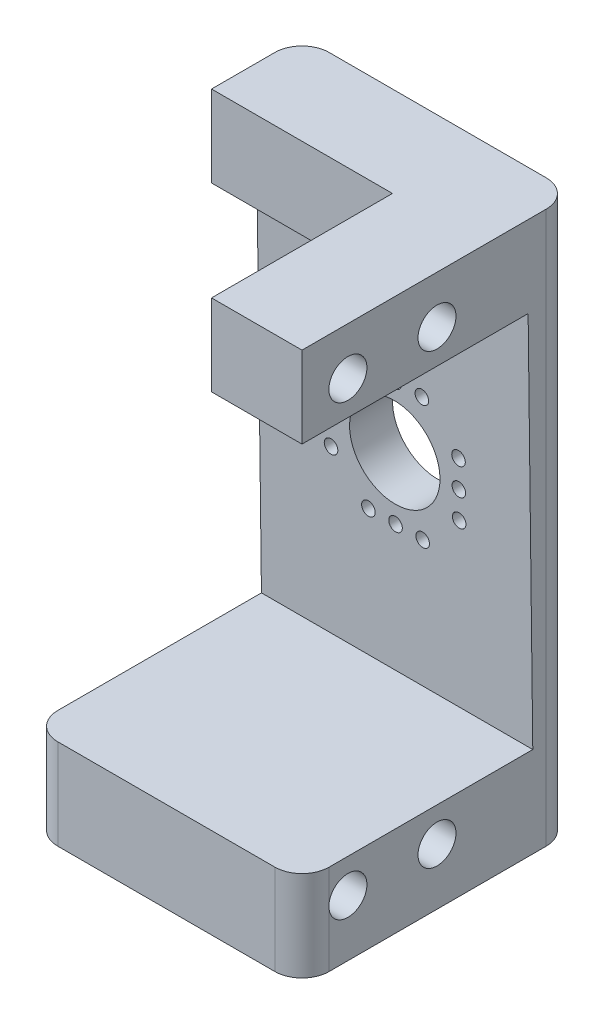
ISO-10303-21;
HEADER;
FILE_DESCRIPTION(('STEP AP214'),'2;1');
FILE_NAME('part.step','',(''),(''),'','','');
FILE_SCHEMA(('AUTOMOTIVE_DESIGN { 1 0 10303 214 1 1 1 1 }'));
ENDSEC;
DATA;
#1=APPLICATION_CONTEXT('core data for automotive mechanical design processes');
#2=APPLICATION_PROTOCOL_DEFINITION('international standard','automotive_design',2000,#1);
#3=PRODUCT_CONTEXT('',#1,'mechanical');
#4=PRODUCT('Part','Part','',(#3));
#5=PRODUCT_RELATED_PRODUCT_CATEGORY('part','',(#4));
#6=PRODUCT_DEFINITION_FORMATION('','',#4);
#7=PRODUCT_DEFINITION_CONTEXT('part definition',#1,'design');
#8=PRODUCT_DEFINITION('design','',#6,#7);
#9=PRODUCT_DEFINITION_SHAPE('','',#8);
#10=(LENGTH_UNIT() NAMED_UNIT(*) SI_UNIT(.MILLI.,.METRE.));
#11=(NAMED_UNIT(*) PLANE_ANGLE_UNIT() SI_UNIT($,.RADIAN.));
#12=(NAMED_UNIT(*) SI_UNIT($,.STERADIAN.) SOLID_ANGLE_UNIT());
#13=UNCERTAINTY_MEASURE_WITH_UNIT(LENGTH_MEASURE(1.E-05),#10,'distance_accuracy_value','');
#14=(GEOMETRIC_REPRESENTATION_CONTEXT(3) GLOBAL_UNCERTAINTY_ASSIGNED_CONTEXT((#13)) GLOBAL_UNIT_ASSIGNED_CONTEXT((#10,
#11,#12)) REPRESENTATION_CONTEXT('',''));
#15=CARTESIAN_POINT('',(0.,0.,0.));
#16=DIRECTION('',(0.,0.,1.));
#17=DIRECTION('',(1.,0.,0.));
#18=AXIS2_PLACEMENT_3D('',#15,#16,#17);
#19=CARTESIAN_POINT('',(0.,0.,0.));
#20=DIRECTION('',(0.,0.,1.));
#21=DIRECTION('',(1.,0.,0.));
#22=AXIS2_PLACEMENT_3D('',#19,#20,#21);
#23=PLANE('',#22);
#24=CARTESIAN_POINT('',(-7.08435334261398,117.142294566927,0.));
#25=DIRECTION('',(0.,0.,1.));
#26=DIRECTION('',(0.,-1.,0.));
#27=AXIS2_PLACEMENT_3D('',#24,#25,#26);
#28=ELLIPSE('',#27,0.750056397949451,0.749999999999998);
#29=CARTESIAN_POINT('',(-7.08435334261398,116.392238168977,0.));
#30=VERTEX_POINT('',#29);
#31=EDGE_CURVE('E677',#30,#30,#28,.T.);
#32=ORIENTED_EDGE('',*,*,#31,.T.);
#33=EDGE_LOOP('',(#32));
#34=FACE_BOUND('',#33,.T.);
#35=CARTESIAN_POINT('',(-7.08435334261398,123.142745750522,0.));
#36=DIRECTION('',(0.,0.,1.));
#37=DIRECTION('',(0.,-1.,0.));
#38=AXIS2_PLACEMENT_3D('',#35,#36,#37);
#39=ELLIPSE('',#38,0.750056397949451,0.749999999999998);
#40=CARTESIAN_POINT('',(-7.08435334261398,122.392689352573,0.));
#41=VERTEX_POINT('',#40);
#42=EDGE_CURVE('E681',#41,#41,#39,.T.);
#43=ORIENTED_EDGE('',*,*,#42,.T.);
#44=EDGE_LOOP('',(#43));
#45=FACE_BOUND('',#44,.T.);
#46=CARTESIAN_POINT('',(-2.92203166447793,127.091992235848,0.));
#47=DIRECTION('',(0.,0.,1.));
#48=DIRECTION('',(0.,-1.,0.));
#49=AXIS2_PLACEMENT_3D('',#46,#47,#48);
#50=ELLIPSE('',#49,0.750056397949459,0.750000000000006);
#51=CARTESIAN_POINT('',(-2.92203166447793,126.341935837898,0.));
#52=VERTEX_POINT('',#51);
#53=EDGE_CURVE('E686',#52,#52,#50,.T.);
#54=ORIENTED_EDGE('',*,*,#53,.T.);
#55=EDGE_LOOP('',(#54));
#56=FACE_BOUND('',#55,.T.);
#57=CARTESIAN_POINT('',(3.07758885491437,127.024506621435,0.));
#58=DIRECTION('',(0.,0.,1.));
#59=DIRECTION('',(0.,-1.,0.));
#60=AXIS2_PLACEMENT_3D('',#57,#58,#59);
#61=ELLIPSE('',#60,0.750056397949452,0.749999999999999);
#62=CARTESIAN_POINT('',(3.07758885491437,126.274450223485,0.));
#63=VERTEX_POINT('',#62);
#64=EDGE_CURVE('E689',#63,#63,#61,.T.);
#65=ORIENTED_EDGE('',*,*,#64,.T.);
#66=EDGE_LOOP('',(#65));
#67=FACE_BOUND('',#66,.T.);
#68=CARTESIAN_POINT('',(0.0777785952182225,127.058249428641,0.));
#69=DIRECTION('',(0.,0.,1.));
#70=DIRECTION('',(0.,-1.,0.));
#71=AXIS2_PLACEMENT_3D('',#68,#69,#70);
#72=ELLIPSE('',#71,0.750056397949452,0.749999999999999);
#73=CARTESIAN_POINT('',(0.0777785952182225,126.308193030692,0.));
#74=VERTEX_POINT('',#73);
#75=EDGE_CURVE('E704',#74,#74,#72,.T.);
#76=ORIENTED_EDGE('',*,*,#75,.T.);
#77=EDGE_LOOP('',(#76));
#78=FACE_BOUND('',#77,.T.);
#79=CARTESIAN_POINT('',(-7.08435334261398,120.142520158724,0.));
#80=DIRECTION('',(0.,0.,1.));
#81=DIRECTION('',(0.,-1.,0.));
#82=AXIS2_PLACEMENT_3D('',#79,#80,#81);
#83=ELLIPSE('',#82,0.750056397949451,0.749999999999998);
#84=CARTESIAN_POINT('',(-7.08435334261398,119.392463760775,0.));
#85=VERTEX_POINT('',#84);
#86=EDGE_CURVE('E707',#85,#85,#83,.T.);
#87=ORIENTED_EDGE('',*,*,#86,.T.);
#88=EDGE_LOOP('',(#87));
#89=FACE_BOUND('',#88,.T.);
#90=CARTESIAN_POINT('',(0.,120.142520158724,0.));
#91=DIRECTION('',(0.,0.,1.));
#92=DIRECTION('',(0.,-1.,0.));
#93=AXIS2_PLACEMENT_3D('',#90,#91,#92);
#94=ELLIPSE('',#93,5.00037598632969,5.);
#95=CARTESIAN_POINT('',(0.,115.142144172395,0.));
#96=VERTEX_POINT('',#95);
#97=EDGE_CURVE('E710',#96,#96,#94,.T.);
#98=ORIENTED_EDGE('',*,*,#97,.T.);
#99=EDGE_LOOP('',(#98));
#100=FACE_BOUND('',#99,.T.);
#101=DIRECTION('',(0.,1.,0.));
#102=VECTOR('',#101,1.);
#103=CARTESIAN_POINT('',(12.,30.,0.));
#104=LINE('',#103,#102);
#105=CARTESIAN_POINT('',(12.,150.,0.));
#106=VERTEX_POINT('',#105);
#107=CARTESIAN_POINT('',(12.,89.,0.));
#108=VERTEX_POINT('',#107);
#109=EDGE_CURVE('E293',#106,#108,#104,.F.);
#110=ORIENTED_EDGE('',*,*,#109,.T.);
#111=DIRECTION('',(-1.,0.,0.));
#112=VECTOR('',#111,1.);
#113=CARTESIAN_POINT('',(0.,89.,0.));
#114=LINE('',#113,#112);
#115=CARTESIAN_POINT('',(-12.,89.,0.));
#116=VERTEX_POINT('',#115);
#117=EDGE_CURVE('E214',#108,#116,#114,.T.);
#118=ORIENTED_EDGE('',*,*,#117,.T.);
#119=DIRECTION('',(0.,-1.,0.));
#120=VECTOR('',#119,1.);
#121=CARTESIAN_POINT('',(-12.,150.,0.));
#122=LINE('',#121,#120);
#123=CARTESIAN_POINT('',(-12.,150.,0.));
#124=VERTEX_POINT('',#123);
#125=EDGE_CURVE('E291',#116,#124,#122,.F.);
#126=ORIENTED_EDGE('',*,*,#125,.T.);
#127=DIRECTION('',(-1.,0.,0.));
#128=VECTOR('',#127,1.);
#129=CARTESIAN_POINT('',(-15.,150.,0.));
#130=LINE('',#129,#128);
#131=EDGE_CURVE('E264',#106,#124,#130,.T.);
#132=ORIENTED_EDGE('',*,*,#131,.F.);
#133=EDGE_LOOP('',(#110,#118,#126,#132));
#134=FACE_BOUND('',#133,.T.);
#135=CARTESIAN_POINT('',(7.08435334261399,123.142745750522,0.));
#136=DIRECTION('',(0.,0.,1.));
#137=DIRECTION('',(0.,-1.,0.));
#138=AXIS2_PLACEMENT_3D('',#135,#136,#137);
#139=ELLIPSE('',#138,0.750056397949451,0.749999999999998);
#140=CARTESIAN_POINT('',(7.08435334261399,122.392689352573,0.));
#141=VERTEX_POINT('',#140);
#142=EDGE_CURVE('E701',#141,#141,#139,.F.);
#143=ORIENTED_EDGE('',*,*,#142,.F.);
#144=EDGE_LOOP('',(#143));
#145=FACE_BOUND('',#144,.T.);
#146=CARTESIAN_POINT('',(2.99999999999999,113.226353463618,0.));
#147=DIRECTION('',(0.,0.,1.));
#148=DIRECTION('',(0.,-1.,0.));
#149=AXIS2_PLACEMENT_3D('',#146,#147,#148);
#150=ELLIPSE('',#149,0.750056397949454,0.750000000000001);
#151=CARTESIAN_POINT('',(2.99999999999999,112.476297065668,0.));
#152=VERTEX_POINT('',#151);
#153=EDGE_CURVE('E698',#152,#152,#150,.F.);
#154=ORIENTED_EDGE('',*,*,#153,.F.);
#155=EDGE_LOOP('',(#154));
#156=FACE_BOUND('',#155,.T.);
#157=CARTESIAN_POINT('',(7.08435334261398,120.142520158724,0.));
#158=DIRECTION('',(0.,0.,1.));
#159=DIRECTION('',(0.,-1.,0.));
#160=AXIS2_PLACEMENT_3D('',#157,#158,#159);
#161=ELLIPSE('',#160,0.750056397949451,0.749999999999998);
#162=CARTESIAN_POINT('',(7.08435334261398,119.392463760775,0.));
#163=VERTEX_POINT('',#162);
#164=EDGE_CURVE('E695',#163,#163,#161,.F.);
#165=ORIENTED_EDGE('',*,*,#164,.F.);
#166=EDGE_LOOP('',(#165));
#167=FACE_BOUND('',#166,.T.);
#168=CARTESIAN_POINT('',(7.08435334261398,117.142294566927,0.));
#169=DIRECTION('',(0.,0.,1.));
#170=DIRECTION('',(0.,-1.,0.));
#171=AXIS2_PLACEMENT_3D('',#168,#169,#170);
#172=ELLIPSE('',#171,0.750056397949451,0.749999999999998);
#173=CARTESIAN_POINT('',(7.08435334261398,116.392238168977,0.));
#174=VERTEX_POINT('',#173);
#175=EDGE_CURVE('E692',#174,#174,#172,.F.);
#176=ORIENTED_EDGE('',*,*,#175,.F.);
#177=EDGE_LOOP('',(#176));
#178=FACE_BOUND('',#177,.T.);
#179=CARTESIAN_POINT('',(-3.00000000000001,113.226353463618,0.));
#180=DIRECTION('',(0.,0.,1.));
#181=DIRECTION('',(0.,-1.,0.));
#182=AXIS2_PLACEMENT_3D('',#179,#180,#181);
#183=ELLIPSE('',#182,0.750056397949454,0.750000000000001);
#184=CARTESIAN_POINT('',(-3.00000000000001,112.476297065668,0.));
#185=VERTEX_POINT('',#184);
#186=EDGE_CURVE('E675',#185,#185,#183,.F.);
#187=ORIENTED_EDGE('',*,*,#186,.F.);
#188=EDGE_LOOP('',(#187));
#189=FACE_BOUND('',#188,.T.);
#190=CARTESIAN_POINT('',(0.,113.226353463618,0.));
#191=DIRECTION('',(0.,0.,1.));
#192=DIRECTION('',(0.,-1.,0.));
#193=AXIS2_PLACEMENT_3D('',#190,#191,#192);
#194=ELLIPSE('',#193,0.750056397949447,0.749999999999994);
#195=CARTESIAN_POINT('',(0.,112.476297065668,0.));
#196=VERTEX_POINT('',#195);
#197=EDGE_CURVE('E197',#196,#196,#194,.F.);
#198=ORIENTED_EDGE('',*,*,#197,.F.);
#199=EDGE_LOOP('',(#198));
#200=FACE_BOUND('',#199,.T.);
#201=ADVANCED_FACE('F50',(#34,#45,#56,#67,#78,#89,#100,#134,#145,#156,#167,#178,#189,#200),#23,.F.);
#202=CARTESIAN_POINT('',(-15.,141.,5.));
#203=DIRECTION('',(0.,0.0122628532442169,-0.999924808388266));
#204=DIRECTION('',(0.,0.999924808388266,0.0122628532442169));
#205=AXIS2_PLACEMENT_3D('',#202,#203,#204);
#206=PLANE('',#205);
#207=CARTESIAN_POINT('',(-7.08435334261398,117.084572574785,4.70670657000616));
#208=DIRECTION('',(0.,-0.0122628532442169,0.999924808388266));
#209=DIRECTION('',(0.,-0.999924808388266,-0.0122628532442169));
#210=AXIS2_PLACEMENT_3D('',#207,#208,#209);
#211=CIRCLE('',#210,0.749999999999998);
#212=CARTESIAN_POINT('',(-7.08435334261398,116.334628968494,4.697509430073));
#213=VERTEX_POINT('',#212);
#214=EDGE_CURVE('E734',#213,#213,#211,.T.);
#215=ORIENTED_EDGE('',*,*,#214,.F.);
#216=EDGE_LOOP('',(#215));
#217=FACE_BOUND('',#216,.T.);
#218=CARTESIAN_POINT('',(-7.08435334261398,123.084121425115,4.78028368947146));
#219=DIRECTION('',(0.,-0.0122628532442169,0.999924808388266));
#220=DIRECTION('',(0.,-0.999924808388266,-0.0122628532442169));
#221=AXIS2_PLACEMENT_3D('',#218,#219,#220);
#222=CIRCLE('',#221,0.749999999999998);
#223=CARTESIAN_POINT('',(-7.08435334261398,122.334177818824,4.7710865495383));
#224=VERTEX_POINT('',#223);
#225=EDGE_CURVE('E721',#224,#224,#222,.T.);
#226=ORIENTED_EDGE('',*,*,#225,.F.);
#227=EDGE_LOOP('',(#226));
#228=FACE_BOUND('',#227,.T.);
#229=CARTESIAN_POINT('',(-2.92203166447793,127.032774032352,4.82870907808942));
#230=DIRECTION('',(0.,-0.0122628532442169,0.999924808388266));
#231=DIRECTION('',(0.,-0.999924808388266,-0.0122628532442169));
#232=AXIS2_PLACEMENT_3D('',#229,#230,#231);
#233=CIRCLE('',#232,0.750000000000006);
#234=CARTESIAN_POINT('',(-2.92203166447793,126.282830426061,4.81951193815626));
#235=VERTEX_POINT('',#234);
#236=EDGE_CURVE('E717',#235,#235,#233,.T.);
#237=ORIENTED_EDGE('',*,*,#236,.F.);
#238=EDGE_LOOP('',(#237));
#239=FACE_BOUND('',#238,.T.);
#240=CARTESIAN_POINT('',(3.07758885491437,126.965298566262,4.82788157412982));
#241=DIRECTION('',(0.,-0.0122628532442169,0.999924808388266));
#242=DIRECTION('',(0.,-0.999924808388266,-0.0122628532442169));
#243=AXIS2_PLACEMENT_3D('',#240,#241,#242);
#244=CIRCLE('',#243,0.749999999999999);
#245=CARTESIAN_POINT('',(3.07758885491437,126.21535495997,4.81868443419665));
#246=VERTEX_POINT('',#245);
#247=EDGE_CURVE('E720',#246,#246,#244,.T.);
#248=ORIENTED_EDGE('',*,*,#247,.F.);
#249=EDGE_LOOP('',(#248));
#250=FACE_BOUND('',#249,.T.);
#251=CARTESIAN_POINT('',(0.0777785952182225,126.999036299307,4.82829532610962));
#252=DIRECTION('',(0.,-0.0122628532442169,0.999924808388266));
#253=DIRECTION('',(0.,-0.999924808388266,-0.0122628532442169));
#254=AXIS2_PLACEMENT_3D('',#251,#252,#253);
#255=CIRCLE('',#254,0.749999999999999);
#256=CARTESIAN_POINT('',(0.0777785952182225,126.249092693016,4.81909818617646));
#257=VERTEX_POINT('',#256);
#258=EDGE_CURVE('E742',#257,#257,#255,.T.);
#259=ORIENTED_EDGE('',*,*,#258,.F.);
#260=EDGE_LOOP('',(#259));
#261=FACE_BOUND('',#260,.T.);
#262=CARTESIAN_POINT('',(-7.08435334261398,120.08434699995,4.74349512973881));
#263=DIRECTION('',(0.,-0.0122628532442169,0.999924808388266));
#264=DIRECTION('',(0.,-0.999924808388266,-0.0122628532442169));
#265=AXIS2_PLACEMENT_3D('',#262,#263,#264);
#266=CIRCLE('',#265,0.749999999999998);
#267=CARTESIAN_POINT('',(-7.08435334261398,119.334403393659,4.73429798980565));
#268=VERTEX_POINT('',#267);
#269=EDGE_CURVE('E739',#268,#268,#266,.T.);
#270=ORIENTED_EDGE('',*,*,#269,.F.);
#271=EDGE_LOOP('',(#270));
#272=FACE_BOUND('',#271,.T.);
#273=CARTESIAN_POINT('',(0.,120.08434699995,4.74349512973881));
#274=DIRECTION('',(0.,-0.0122628532442169,0.999924808388266));
#275=DIRECTION('',(0.,-0.999924808388266,-0.0122628532442169));
#276=AXIS2_PLACEMENT_3D('',#273,#274,#275);
#277=CIRCLE('',#276,5.);
#278=CARTESIAN_POINT('',(0.,115.084722958009,4.68218086351773));
#279=VERTEX_POINT('',#278);
#280=EDGE_CURVE('E713',#279,#279,#277,.T.);
#281=ORIENTED_EDGE('',*,*,#280,.F.);
#282=EDGE_LOOP('',(#281));
#283=FACE_BOUND('',#282,.T.);
#284=DIRECTION('',(0.,0.999924808388266,0.0122628532442169));
#285=VECTOR('',#284,1.);
#286=CARTESIAN_POINT('',(15.,141.,5.));
#287=LINE('',#286,#285);
#288=CARTESIAN_POINT('',(15.,99.,4.48492143415535));
#289=VERTEX_POINT('',#288);
#290=CARTESIAN_POINT('',(15.,141.,5.));
#291=VERTEX_POINT('',#290);
#292=EDGE_CURVE('E194',#289,#291,#287,.T.);
#293=ORIENTED_EDGE('',*,*,#292,.T.);
#294=DIRECTION('',(1.,0.,0.));
#295=VECTOR('',#294,1.);
#296=CARTESIAN_POINT('',(-15.,141.,5.));
#297=LINE('',#296,#295);
#298=CARTESIAN_POINT('',(-15.,141.,5.));
#299=VERTEX_POINT('',#298);
#300=EDGE_CURVE('E187',#299,#291,#297,.T.);
#301=ORIENTED_EDGE('',*,*,#300,.F.);
#302=DIRECTION('',(0.,0.999924808388266,0.0122628532442169));
#303=VECTOR('',#302,1.);
#304=CARTESIAN_POINT('',(-15.,141.,5.));
#305=LINE('',#304,#303);
#306=CARTESIAN_POINT('',(-15.,99.,4.48492143415535));
#307=VERTEX_POINT('',#306);
#308=EDGE_CURVE('E171',#307,#299,#305,.T.);
#309=ORIENTED_EDGE('',*,*,#308,.F.);
#310=DIRECTION('',(1.,0.,0.));
#311=VECTOR('',#310,1.);
#312=CARTESIAN_POINT('',(-15.,99.,4.48492143415535));
#313=LINE('',#312,#311);
#314=EDGE_CURVE('E181',#307,#289,#313,.T.);
#315=ORIENTED_EDGE('',*,*,#314,.T.);
#316=EDGE_LOOP('',(#293,#301,#309,#315));
#317=FACE_BOUND('',#316,.T.);
#318=CARTESIAN_POINT('',(7.08435334261399,123.084121425115,4.78028368947146));
#319=DIRECTION('',(0.,0.0122628532442169,-0.999924808388266));
#320=DIRECTION('',(0.,0.999924808388266,0.0122628532442169));
#321=AXIS2_PLACEMENT_3D('',#318,#319,#320);
#322=CIRCLE('',#321,0.749999999999998);
#323=CARTESIAN_POINT('',(7.08435334261399,123.834065031406,4.78948082940463));
#324=VERTEX_POINT('',#323);
#325=EDGE_CURVE('E745',#324,#324,#322,.T.);
#326=ORIENTED_EDGE('',*,*,#325,.T.);
#327=EDGE_LOOP('',(#326));
#328=FACE_BOUND('',#327,.T.);
#329=CARTESIAN_POINT('',(2.99999999999999,113.169220341183,4.65868956969043));
#330=DIRECTION('',(0.,-0.0122628532442169,0.999924808388266));
#331=DIRECTION('',(0.,-0.999924808388266,-0.0122628532442169));
#332=AXIS2_PLACEMENT_3D('',#329,#330,#331);
#333=CIRCLE('',#332,0.750000000000001);
#334=CARTESIAN_POINT('',(2.99999999999999,112.419276734891,4.64949242975726));
#335=VERTEX_POINT('',#334);
#336=EDGE_CURVE('E731',#335,#335,#333,.F.);
#337=ORIENTED_EDGE('',*,*,#336,.T.);
#338=EDGE_LOOP('',(#337));
#339=FACE_BOUND('',#338,.T.);
#340=CARTESIAN_POINT('',(7.08435334261398,120.08434699995,4.74349512973881));
#341=DIRECTION('',(0.,-0.0122628532442169,0.999924808388266));
#342=DIRECTION('',(0.,-0.999924808388266,-0.0122628532442169));
#343=AXIS2_PLACEMENT_3D('',#340,#341,#342);
#344=CIRCLE('',#343,0.749999999999998);
#345=CARTESIAN_POINT('',(7.08435334261398,119.334403393659,4.73429798980565));
#346=VERTEX_POINT('',#345);
#347=EDGE_CURVE('E716',#346,#346,#344,.F.);
#348=ORIENTED_EDGE('',*,*,#347,.T.);
#349=EDGE_LOOP('',(#348));
#350=FACE_BOUND('',#349,.T.);
#351=CARTESIAN_POINT('',(7.08435334261398,117.084572574785,4.70670657000616));
#352=DIRECTION('',(0.,-0.0122628532442169,0.999924808388266));
#353=DIRECTION('',(0.,-0.999924808388266,-0.0122628532442169));
#354=AXIS2_PLACEMENT_3D('',#351,#352,#353);
#355=CIRCLE('',#354,0.749999999999998);
#356=CARTESIAN_POINT('',(7.08435334261398,116.334628968494,4.697509430073));
#357=VERTEX_POINT('',#356);
#358=EDGE_CURVE('E724',#357,#357,#355,.F.);
#359=ORIENTED_EDGE('',*,*,#358,.T.);
#360=EDGE_LOOP('',(#359));
#361=FACE_BOUND('',#360,.T.);
#362=CARTESIAN_POINT('',(-3.00000000000001,113.169220341183,4.65868956969043));
#363=DIRECTION('',(0.,-0.0122628532442169,0.999924808388266));
#364=DIRECTION('',(0.,-0.999924808388266,-0.0122628532442169));
#365=AXIS2_PLACEMENT_3D('',#362,#363,#364);
#366=CIRCLE('',#365,0.750000000000001);
#367=CARTESIAN_POINT('',(-3.00000000000001,112.419276734891,4.64949242975726));
#368=VERTEX_POINT('',#367);
#369=EDGE_CURVE('E730',#368,#368,#366,.F.);
#370=ORIENTED_EDGE('',*,*,#369,.T.);
#371=EDGE_LOOP('',(#370));
#372=FACE_BOUND('',#371,.T.);
#373=CARTESIAN_POINT('',(0.,113.169220341183,4.65868956969043));
#374=DIRECTION('',(0.,-0.0122628532442169,0.999924808388266));
#375=DIRECTION('',(0.,-0.999924808388266,-0.0122628532442169));
#376=AXIS2_PLACEMENT_3D('',#373,#374,#375);
#377=CIRCLE('',#376,0.749999999999994);
#378=CARTESIAN_POINT('',(0.,112.419276734891,4.64949242975726));
#379=VERTEX_POINT('',#378);
#380=EDGE_CURVE('E671',#379,#379,#377,.F.);
#381=ORIENTED_EDGE('',*,*,#380,.T.);
#382=EDGE_LOOP('',(#381));
#383=FACE_BOUND('',#382,.T.);
#384=ADVANCED_FACE('F190',(#217,#228,#239,#250,#261,#272,#283,#317,#328,#339,#350,#361,#372,
#383),#206,.F.);
#385=CARTESIAN_POINT('',(0.,0.,30.));
#386=DIRECTION('',(0.,0.,1.));
#387=DIRECTION('',(1.,0.,0.));
#388=AXIS2_PLACEMENT_3D('',#385,#386,#387);
#389=PLANE('',#388);
#390=DIRECTION('',(0.,1.,0.));
#391=VECTOR('',#390,1.);
#392=CARTESIAN_POINT('',(5.,141.,30.));
#393=LINE('',#392,#391);
#394=CARTESIAN_POINT('',(5.,141.,30.));
#395=VERTEX_POINT('',#394);
#396=CARTESIAN_POINT('',(5.,150.,30.));
#397=VERTEX_POINT('',#396);
#398=EDGE_CURVE('E244',#395,#397,#393,.T.);
#399=ORIENTED_EDGE('',*,*,#398,.F.);
#400=DIRECTION('',(-1.,0.,0.));
#401=VECTOR('',#400,1.);
#402=CARTESIAN_POINT('',(5.,141.,30.));
#403=LINE('',#402,#401);
#404=CARTESIAN_POINT('',(15.,141.,30.));
#405=VERTEX_POINT('',#404);
#406=EDGE_CURVE('E251',#405,#395,#403,.T.);
#407=ORIENTED_EDGE('',*,*,#406,.F.);
#408=DIRECTION('',(0.,1.,0.));
#409=VECTOR('',#408,1.);
#410=CARTESIAN_POINT('',(15.,150.,30.));
#411=LINE('',#410,#409);
#412=CARTESIAN_POINT('',(15.,150.,30.));
#413=VERTEX_POINT('',#412);
#414=EDGE_CURVE('E258',#405,#413,#411,.T.);
#415=ORIENTED_EDGE('',*,*,#414,.T.);
#416=DIRECTION('',(-1.,0.,0.));
#417=VECTOR('',#416,1.);
#418=CARTESIAN_POINT('',(-15.,150.,30.));
#419=LINE('',#418,#417);
#420=EDGE_CURVE('E268',#413,#397,#419,.T.);
#421=ORIENTED_EDGE('',*,*,#420,.T.);
#422=EDGE_LOOP('',(#399,#407,#415,#421));
#423=FACE_BOUND('',#422,.T.);
#424=ADVANCED_FACE('F361',(#423),#389,.T.);
#425=DIRECTION('',(-1.,0.,0.));
#426=VECTOR('',#425,1.);
#427=CARTESIAN_POINT('',(0.,89.,30.));
#428=LINE('',#427,#426);
#429=CARTESIAN_POINT('',(12.,89.,30.));
#430=VERTEX_POINT('',#429);
#431=CARTESIAN_POINT('',(-12.,89.,30.));
#432=VERTEX_POINT('',#431);
#433=EDGE_CURVE('E206',#430,#432,#428,.T.);
#434=ORIENTED_EDGE('',*,*,#433,.F.);
#435=DIRECTION('',(0.,1.,0.));
#436=VECTOR('',#435,1.);
#437=CARTESIAN_POINT('',(12.,0.,30.));
#438=LINE('',#437,#436);
#439=CARTESIAN_POINT('',(12.,99.,30.));
#440=VERTEX_POINT('',#439);
#441=EDGE_CURVE('E73',#430,#440,#438,.T.);
#442=ORIENTED_EDGE('',*,*,#441,.T.);
#443=DIRECTION('',(1.,0.,0.));
#444=VECTOR('',#443,1.);
#445=CARTESIAN_POINT('',(-15.,99.,30.));
#446=LINE('',#445,#444);
#447=CARTESIAN_POINT('',(-12.,99.,30.));
#448=VERTEX_POINT('',#447);
#449=EDGE_CURVE('E239',#448,#440,#446,.T.);
#450=ORIENTED_EDGE('',*,*,#449,.F.);
#451=DIRECTION('',(0.,-1.,0.));
#452=VECTOR('',#451,1.);
#453=CARTESIAN_POINT('',(-12.,0.,30.));
#454=LINE('',#453,#452);
#455=EDGE_CURVE('E303',#448,#432,#454,.T.);
#456=ORIENTED_EDGE('',*,*,#455,.T.);
#457=EDGE_LOOP('',(#434,#442,#450,#456));
#458=FACE_BOUND('',#457,.T.);
#459=ADVANCED_FACE('F352',(#458),#389,.T.);
#460=CARTESIAN_POINT('',(-15.,30.,0.));
#461=DIRECTION('',(-1.,0.,0.));
#462=DIRECTION('',(0.,0.,1.));
#463=AXIS2_PLACEMENT_3D('',#460,#461,#462);
#464=PLANE('',#463);
#465=DIRECTION('',(0.,0.,1.));
#466=VECTOR('',#465,1.);
#467=CARTESIAN_POINT('',(-15.,99.,10.));
#468=LINE('',#467,#466);
#469=CARTESIAN_POINT('',(-15.,99.,27.));
#470=VERTEX_POINT('',#469);
#471=EDGE_CURVE('E165',#307,#470,#468,.T.);
#472=ORIENTED_EDGE('',*,*,#471,.F.);
#473=ORIENTED_EDGE('',*,*,#308,.T.);
#474=DIRECTION('',(0.,0.,1.));
#475=VECTOR('',#474,1.);
#476=CARTESIAN_POINT('',(-15.,141.,10.));
#477=LINE('',#476,#475);
#478=CARTESIAN_POINT('',(-15.,141.,10.));
#479=VERTEX_POINT('',#478);
#480=EDGE_CURVE('E188',#299,#479,#477,.T.);
#481=ORIENTED_EDGE('',*,*,#480,.T.);
#482=DIRECTION('',(0.,-1.,0.));
#483=VECTOR('',#482,1.);
#484=CARTESIAN_POINT('',(-15.,141.,10.));
#485=LINE('',#484,#483);
#486=CARTESIAN_POINT('',(-15.,150.,10.));
#487=VERTEX_POINT('',#486);
#488=EDGE_CURVE('E240',#487,#479,#485,.T.);
#489=ORIENTED_EDGE('',*,*,#488,.F.);
#490=DIRECTION('',(0.,0.,1.));
#491=VECTOR('',#490,1.);
#492=CARTESIAN_POINT('',(-15.,150.,0.));
#493=LINE('',#492,#491);
#494=CARTESIAN_POINT('',(-15.,150.,3.));
#495=VERTEX_POINT('',#494);
#496=EDGE_CURVE('E273',#495,#487,#493,.T.);
#497=ORIENTED_EDGE('',*,*,#496,.F.);
#498=DIRECTION('',(0.,-1.,0.));
#499=VECTOR('',#498,1.);
#500=CARTESIAN_POINT('',(-15.,30.,3.));
#501=LINE('',#500,#499);
#502=CARTESIAN_POINT('',(-15.,89.,3.));
#503=VERTEX_POINT('',#502);
#504=EDGE_CURVE('E299',#495,#503,#501,.T.);
#505=ORIENTED_EDGE('',*,*,#504,.T.);
#506=DIRECTION('',(0.,0.,-1.));
#507=VECTOR('',#506,1.);
#508=CARTESIAN_POINT('',(-15.,89.,0.));
#509=LINE('',#508,#507);
#510=CARTESIAN_POINT('',(-15.,89.,27.));
#511=VERTEX_POINT('',#510);
#512=EDGE_CURVE('E212',#511,#503,#509,.T.);
#513=ORIENTED_EDGE('',*,*,#512,.F.);
#514=DIRECTION('',(0.,-1.,0.));
#515=VECTOR('',#514,1.);
#516=CARTESIAN_POINT('',(-15.,30.,27.));
#517=LINE('',#516,#515);
#518=CARTESIAN_POINT('',(-15.,94.926928800417,27.));
#519=VERTEX_POINT('',#518);
#520=EDGE_CURVE('E297',#511,#519,#517,.F.);
#521=ORIENTED_EDGE('',*,*,#520,.T.);
#522=CARTESIAN_POINT('',(-15.,95.25,24.925));
#523=DIRECTION('',(-1.,0.,0.));
#524=DIRECTION('',(0.,0.,1.));
#525=AXIS2_PLACEMENT_3D('',#522,#523,#524);
#526=CIRCLE('',#525,2.1);
#527=CARTESIAN_POINT('',(-15.,95.573071199583,27.));
#528=VERTEX_POINT('',#527);
#529=EDGE_CURVE('E235',#528,#519,#526,.T.);
#530=ORIENTED_EDGE('',*,*,#529,.F.);
#531=DIRECTION('',(0.,-1.,0.));
#532=VECTOR('',#531,1.);
#533=CARTESIAN_POINT('',(-15.,30.,27.));
#534=LINE('',#533,#532);
#535=EDGE_CURVE('E174',#528,#470,#534,.F.);
#536=ORIENTED_EDGE('',*,*,#535,.T.);
#537=EDGE_LOOP('',(#472,#473,#481,#489,#497,#505,#513,#521,#530,#536));
#538=FACE_BOUND('',#537,.T.);
#539=CARTESIAN_POINT('',(-15.,95.25,15.075));
#540=DIRECTION('',(-1.,0.,0.));
#541=DIRECTION('',(0.,0.,1.));
#542=AXIS2_PLACEMENT_3D('',#539,#540,#541);
#543=CIRCLE('',#542,2.09999999999999);
#544=CARTESIAN_POINT('',(-15.,95.25,17.175));
#545=VERTEX_POINT('',#544);
#546=EDGE_CURVE('E232',#545,#545,#543,.T.);
#547=ORIENTED_EDGE('',*,*,#546,.F.);
#548=EDGE_LOOP('',(#547));
#549=FACE_BOUND('',#548,.T.);
#550=ADVANCED_FACE('F167',(#538,#549),#464,.T.);
#551=CARTESIAN_POINT('',(-15.,150.,0.));
#552=DIRECTION('',(0.,1.,0.));
#553=DIRECTION('',(0.,0.,1.));
#554=AXIS2_PLACEMENT_3D('',#551,#552,#553);
#555=PLANE('',#554);
#556=DIRECTION('',(0.,0.,1.));
#557=VECTOR('',#556,1.);
#558=CARTESIAN_POINT('',(15.,150.,0.));
#559=LINE('',#558,#557);
#560=CARTESIAN_POINT('',(15.,150.,3.));
#561=VERTEX_POINT('',#560);
#562=EDGE_CURVE('E267',#561,#413,#559,.T.);
#563=ORIENTED_EDGE('',*,*,#562,.F.);
#564=CARTESIAN_POINT('',(12.,150.,3.));
#565=DIRECTION('',(0.,1.,0.));
#566=DIRECTION('',(0.,0.,1.));
#567=AXIS2_PLACEMENT_3D('',#564,#565,#566);
#568=CIRCLE('',#567,3.);
#569=EDGE_CURVE('E289',#561,#106,#568,.T.);
#570=ORIENTED_EDGE('',*,*,#569,.T.);
#571=ORIENTED_EDGE('',*,*,#131,.T.);
#572=CARTESIAN_POINT('',(-12.,150.,3.));
#573=DIRECTION('',(0.,1.,0.));
#574=DIRECTION('',(0.,0.,1.));
#575=AXIS2_PLACEMENT_3D('',#572,#573,#574);
#576=CIRCLE('',#575,3.);
#577=EDGE_CURVE('E287',#124,#495,#576,.T.);
#578=ORIENTED_EDGE('',*,*,#577,.T.);
#579=ORIENTED_EDGE('',*,*,#496,.T.);
#580=DIRECTION('',(-1.,0.,0.));
#581=VECTOR('',#580,1.);
#582=CARTESIAN_POINT('',(5.,150.,10.));
#583=LINE('',#582,#581);
#584=CARTESIAN_POINT('',(5.,150.,10.));
#585=VERTEX_POINT('',#584);
#586=EDGE_CURVE('E178',#585,#487,#583,.T.);
#587=ORIENTED_EDGE('',*,*,#586,.F.);
#588=DIRECTION('',(0.,0.,1.));
#589=VECTOR('',#588,1.);
#590=CARTESIAN_POINT('',(5.,150.,10.));
#591=LINE('',#590,#589);
#592=EDGE_CURVE('E255',#585,#397,#591,.T.);
#593=ORIENTED_EDGE('',*,*,#592,.T.);
#594=ORIENTED_EDGE('',*,*,#420,.F.);
#595=EDGE_LOOP('',(#563,#570,#571,#578,#579,#587,#593,#594));
#596=FACE_BOUND('',#595,.T.);
#597=ADVANCED_FACE('F351',(#596),#555,.T.);
#598=CARTESIAN_POINT('',(15.,150.,0.));
#599=DIRECTION('',(1.,0.,0.));
#600=DIRECTION('',(0.,0.,-1.));
#601=AXIS2_PLACEMENT_3D('',#598,#599,#600);
#602=PLANE('',#601);
#603=ORIENTED_EDGE('',*,*,#292,.F.);
#604=DIRECTION('',(0.,0.,1.));
#605=VECTOR('',#604,1.);
#606=CARTESIAN_POINT('',(15.,99.,10.));
#607=LINE('',#606,#605);
#608=CARTESIAN_POINT('',(15.,99.,27.));
#609=VERTEX_POINT('',#608);
#610=EDGE_CURVE('E177',#289,#609,#607,.T.);
#611=ORIENTED_EDGE('',*,*,#610,.T.);
#612=DIRECTION('',(0.,1.,0.));
#613=VECTOR('',#612,1.);
#614=CARTESIAN_POINT('',(15.,150.,27.));
#615=LINE('',#614,#613);
#616=CARTESIAN_POINT('',(15.,95.573071199583,27.));
#617=VERTEX_POINT('',#616);
#618=EDGE_CURVE('E283',#609,#617,#615,.F.);
#619=ORIENTED_EDGE('',*,*,#618,.T.);
#620=CARTESIAN_POINT('',(15.,95.25,24.925));
#621=DIRECTION('',(1.,0.,0.));
#622=DIRECTION('',(0.,0.,1.));
#623=AXIS2_PLACEMENT_3D('',#620,#621,#622);
#624=CIRCLE('',#623,2.1);
#625=CARTESIAN_POINT('',(15.,94.926928800417,27.));
#626=VERTEX_POINT('',#625);
#627=EDGE_CURVE('E219',#626,#617,#624,.T.);
#628=ORIENTED_EDGE('',*,*,#627,.F.);
#629=DIRECTION('',(0.,1.,0.));
#630=VECTOR('',#629,1.);
#631=CARTESIAN_POINT('',(15.,150.,27.));
#632=LINE('',#631,#630);
#633=CARTESIAN_POINT('',(15.,89.,27.));
#634=VERTEX_POINT('',#633);
#635=EDGE_CURVE('E275',#626,#634,#632,.F.);
#636=ORIENTED_EDGE('',*,*,#635,.T.);
#637=DIRECTION('',(0.,0.,1.));
#638=VECTOR('',#637,1.);
#639=CARTESIAN_POINT('',(15.,89.,0.));
#640=LINE('',#639,#638);
#641=CARTESIAN_POINT('',(15.,89.,3.));
#642=VERTEX_POINT('',#641);
#643=EDGE_CURVE('E65',#642,#634,#640,.T.);
#644=ORIENTED_EDGE('',*,*,#643,.F.);
#645=DIRECTION('',(0.,1.,0.));
#646=VECTOR('',#645,1.);
#647=CARTESIAN_POINT('',(15.,150.,3.));
#648=LINE('',#647,#646);
#649=EDGE_CURVE('E285',#642,#561,#648,.T.);
#650=ORIENTED_EDGE('',*,*,#649,.T.);
#651=ORIENTED_EDGE('',*,*,#562,.T.);
#652=ORIENTED_EDGE('',*,*,#414,.F.);
#653=DIRECTION('',(0.,0.,1.));
#654=VECTOR('',#653,1.);
#655=CARTESIAN_POINT('',(15.,141.,10.));
#656=LINE('',#655,#654);
#657=EDGE_CURVE('E261',#291,#405,#656,.T.);
#658=ORIENTED_EDGE('',*,*,#657,.F.);
#659=EDGE_LOOP('',(#603,#611,#619,#628,#636,#644,#650,#651,#652,#658));
#660=FACE_BOUND('',#659,.T.);
#661=CARTESIAN_POINT('',(15.,144.75,15.075));
#662=DIRECTION('',(1.,0.,0.));
#663=DIRECTION('',(0.,0.,-1.));
#664=AXIS2_PLACEMENT_3D('',#661,#662,#663);
#665=CIRCLE('',#664,2.09999999999999);
#666=CARTESIAN_POINT('',(15.,144.75,12.975));
#667=VERTEX_POINT('',#666);
#668=EDGE_CURVE('E224',#667,#667,#665,.T.);
#669=ORIENTED_EDGE('',*,*,#668,.F.);
#670=EDGE_LOOP('',(#669));
#671=FACE_BOUND('',#670,.T.);
#672=CARTESIAN_POINT('',(15.,144.75,24.925));
#673=DIRECTION('',(1.,0.,0.));
#674=DIRECTION('',(0.,0.,-1.));
#675=AXIS2_PLACEMENT_3D('',#672,#673,#674);
#676=CIRCLE('',#675,2.09999999999999);
#677=CARTESIAN_POINT('',(15.,144.75,22.825));
#678=VERTEX_POINT('',#677);
#679=EDGE_CURVE('E220',#678,#678,#676,.T.);
#680=ORIENTED_EDGE('',*,*,#679,.F.);
#681=EDGE_LOOP('',(#680));
#682=FACE_BOUND('',#681,.T.);
#683=CARTESIAN_POINT('',(15.,95.25,15.075));
#684=DIRECTION('',(1.,0.,0.));
#685=DIRECTION('',(0.,0.,1.));
#686=AXIS2_PLACEMENT_3D('',#683,#684,#685);
#687=CIRCLE('',#686,2.09999999999999);
#688=CARTESIAN_POINT('',(15.,95.25,17.175));
#689=VERTEX_POINT('',#688);
#690=EDGE_CURVE('E223',#689,#689,#687,.T.);
#691=ORIENTED_EDGE('',*,*,#690,.F.);
#692=EDGE_LOOP('',(#691));
#693=FACE_BOUND('',#692,.T.);
#694=ADVANCED_FACE('F342',(#660,#671,#682,#693),#602,.T.);
#695=CARTESIAN_POINT('',(5.,141.,10.));
#696=DIRECTION('',(1.,0.,0.));
#697=DIRECTION('',(0.,0.,-1.));
#698=AXIS2_PLACEMENT_3D('',#695,#696,#697);
#699=PLANE('',#698);
#700=CARTESIAN_POINT('',(5.,144.75,15.075));
#701=DIRECTION('',(1.,0.,0.));
#702=DIRECTION('',(0.,0.,-1.));
#703=AXIS2_PLACEMENT_3D('',#700,#701,#702);
#704=CIRCLE('',#703,2.09999999999999);
#705=CARTESIAN_POINT('',(5.,144.75,12.975));
#706=VERTEX_POINT('',#705);
#707=EDGE_CURVE('E236',#706,#706,#704,.T.);
#708=ORIENTED_EDGE('',*,*,#707,.T.);
#709=EDGE_LOOP('',(#708));
#710=FACE_BOUND('',#709,.T.);
#711=CARTESIAN_POINT('',(5.,144.75,24.925));
#712=DIRECTION('',(1.,0.,0.));
#713=DIRECTION('',(0.,0.,-1.));
#714=AXIS2_PLACEMENT_3D('',#711,#712,#713);
#715=CIRCLE('',#714,2.09999999999999);
#716=CARTESIAN_POINT('',(5.,144.75,22.825));
#717=VERTEX_POINT('',#716);
#718=EDGE_CURVE('E231',#717,#717,#715,.T.);
#719=ORIENTED_EDGE('',*,*,#718,.T.);
#720=EDGE_LOOP('',(#719));
#721=FACE_BOUND('',#720,.T.);
#722=ORIENTED_EDGE('',*,*,#398,.T.);
#723=ORIENTED_EDGE('',*,*,#592,.F.);
#724=DIRECTION('',(0.,1.,0.));
#725=VECTOR('',#724,1.);
#726=CARTESIAN_POINT('',(5.,141.,10.));
#727=LINE('',#726,#725);
#728=CARTESIAN_POINT('',(5.,141.,10.));
#729=VERTEX_POINT('',#728);
#730=EDGE_CURVE('E243',#729,#585,#727,.T.);
#731=ORIENTED_EDGE('',*,*,#730,.F.);
#732=DIRECTION('',(0.,0.,1.));
#733=VECTOR('',#732,1.);
#734=CARTESIAN_POINT('',(5.,141.,10.));
#735=LINE('',#734,#733);
#736=EDGE_CURVE('E259',#729,#395,#735,.T.);
#737=ORIENTED_EDGE('',*,*,#736,.T.);
#738=EDGE_LOOP('',(#722,#723,#731,#737));
#739=FACE_BOUND('',#738,.T.);
#740=ADVANCED_FACE('F338',(#710,#721,#739),#699,.F.);
#741=CARTESIAN_POINT('',(5.,141.,10.));
#742=DIRECTION('',(0.,1.,0.));
#743=DIRECTION('',(0.,0.,1.));
#744=AXIS2_PLACEMENT_3D('',#741,#742,#743);
#745=PLANE('',#744);
#746=ORIENTED_EDGE('',*,*,#406,.T.);
#747=ORIENTED_EDGE('',*,*,#736,.F.);
#748=DIRECTION('',(1.,0.,0.));
#749=VECTOR('',#748,1.);
#750=CARTESIAN_POINT('',(-15.,141.,10.));
#751=LINE('',#750,#749);
#752=EDGE_CURVE('E202',#479,#729,#751,.T.);
#753=ORIENTED_EDGE('',*,*,#752,.F.);
#754=ORIENTED_EDGE('',*,*,#480,.F.);
#755=ORIENTED_EDGE('',*,*,#300,.T.);
#756=ORIENTED_EDGE('',*,*,#657,.T.);
#757=EDGE_LOOP('',(#746,#747,#753,#754,#755,#756));
#758=FACE_BOUND('',#757,.T.);
#759=ADVANCED_FACE('F341',(#758),#745,.F.);
#760=CARTESIAN_POINT('',(-15.,99.,10.));
#761=DIRECTION('',(0.,-1.,0.));
#762=DIRECTION('',(0.,0.,-1.));
#763=AXIS2_PLACEMENT_3D('',#760,#761,#762);
#764=PLANE('',#763);
#765=ORIENTED_EDGE('',*,*,#471,.T.);
#766=CARTESIAN_POINT('',(-12.,99.,27.));
#767=DIRECTION('',(0.,-1.,0.));
#768=DIRECTION('',(0.,0.,-1.));
#769=AXIS2_PLACEMENT_3D('',#766,#767,#768);
#770=CIRCLE('',#769,3.);
#771=EDGE_CURVE('E59',#470,#448,#770,.F.);
#772=ORIENTED_EDGE('',*,*,#771,.T.);
#773=ORIENTED_EDGE('',*,*,#449,.T.);
#774=CARTESIAN_POINT('',(12.,99.,27.));
#775=DIRECTION('',(0.,-1.,0.));
#776=DIRECTION('',(0.,0.,-1.));
#777=AXIS2_PLACEMENT_3D('',#774,#775,#776);
#778=CIRCLE('',#777,3.);
#779=EDGE_CURVE('E385',#440,#609,#778,.F.);
#780=ORIENTED_EDGE('',*,*,#779,.T.);
#781=ORIENTED_EDGE('',*,*,#610,.F.);
#782=ORIENTED_EDGE('',*,*,#314,.F.);
#783=EDGE_LOOP('',(#765,#772,#773,#780,#781,#782));
#784=FACE_BOUND('',#783,.T.);
#785=ADVANCED_FACE('F182',(#784),#764,.F.);
#786=CARTESIAN_POINT('',(0.,0.,10.));
#787=DIRECTION('',(0.,0.,1.));
#788=DIRECTION('',(1.,0.,0.));
#789=AXIS2_PLACEMENT_3D('',#786,#787,#788);
#790=PLANE('',#789);
#791=ORIENTED_EDGE('',*,*,#752,.T.);
#792=ORIENTED_EDGE('',*,*,#730,.T.);
#793=ORIENTED_EDGE('',*,*,#586,.T.);
#794=ORIENTED_EDGE('',*,*,#488,.T.);
#795=EDGE_LOOP('',(#791,#792,#793,#794));
#796=FACE_BOUND('',#795,.T.);
#797=ADVANCED_FACE('F333',(#796),#790,.T.);
#798=CARTESIAN_POINT('',(-27.375,144.75,24.925));
#799=DIRECTION('',(1.,0.,0.));
#800=DIRECTION('',(0.,0.,-1.));
#801=AXIS2_PLACEMENT_3D('',#798,#799,#800);
#802=CYLINDRICAL_SURFACE('',#801,2.09999999999999);
#803=ORIENTED_EDGE('',*,*,#679,.T.);
#804=EDGE_LOOP('',(#803));
#805=FACE_BOUND('',#804,.T.);
#806=ORIENTED_EDGE('',*,*,#718,.F.);
#807=EDGE_LOOP('',(#806));
#808=FACE_BOUND('',#807,.T.);
#809=ADVANCED_FACE('F336',(#805,#808),#802,.F.);
#810=CARTESIAN_POINT('',(-27.375,144.75,15.075));
#811=DIRECTION('',(1.,0.,0.));
#812=DIRECTION('',(0.,0.,-1.));
#813=AXIS2_PLACEMENT_3D('',#810,#811,#812);
#814=CYLINDRICAL_SURFACE('',#813,2.09999999999999);
#815=ORIENTED_EDGE('',*,*,#668,.T.);
#816=EDGE_LOOP('',(#815));
#817=FACE_BOUND('',#816,.T.);
#818=ORIENTED_EDGE('',*,*,#707,.F.);
#819=EDGE_LOOP('',(#818));
#820=FACE_BOUND('',#819,.T.);
#821=ADVANCED_FACE('F327',(#817,#820),#814,.F.);
#822=CARTESIAN_POINT('',(-27.375,95.25,15.075));
#823=DIRECTION('',(1.,0.,0.));
#824=DIRECTION('',(0.,0.,-1.));
#825=AXIS2_PLACEMENT_3D('',#822,#823,#824);
#826=CYLINDRICAL_SURFACE('',#825,2.09999999999999);
#827=ORIENTED_EDGE('',*,*,#546,.T.);
#828=EDGE_LOOP('',(#827));
#829=FACE_BOUND('',#828,.T.);
#830=ORIENTED_EDGE('',*,*,#690,.T.);
#831=EDGE_LOOP('',(#830));
#832=FACE_BOUND('',#831,.T.);
#833=ADVANCED_FACE('F325',(#829,#832),#826,.F.);
#834=CARTESIAN_POINT('',(-27.375,95.25,24.925));
#835=DIRECTION('',(1.,0.,0.));
#836=DIRECTION('',(0.,0.,-1.));
#837=AXIS2_PLACEMENT_3D('',#834,#835,#836);
#838=CYLINDRICAL_SURFACE('',#837,2.1);
#839=ORIENTED_EDGE('',*,*,#529,.T.);
#840=CARTESIAN_POINT('',(-15.,94.926928800417,27.));
#841=CARTESIAN_POINT('',(-14.9999913462623,94.9805036957936,27.0083456609284));
#842=CARTESIAN_POINT('',(-14.9999651748439,95.0344022942286,27.0146080622625));
#843=CARTESIAN_POINT('',(-14.9999174306417,95.1422018663987,27.022922867291));
#844=CARTESIAN_POINT('',(-14.9998958315249,95.1961009331994,27.025));
#845=CARTESIAN_POINT('',(-14.9998958315249,95.3038990668006,27.025));
#846=CARTESIAN_POINT('',(-14.9999174306417,95.3577981336013,27.022922867291));
#847=CARTESIAN_POINT('',(-14.9999651748439,95.4655977057714,27.0146080622625));
#848=CARTESIAN_POINT('',(-14.9999913462623,95.5194963042064,27.0083456609284));
#849=CARTESIAN_POINT('',(-15.,95.573071199583,27.));
#850=B_SPLINE_CURVE_WITH_KNOTS('',3,(#840,#841,#842,#843,#844,#845,#846,#847,#848,#849),
.UNSPECIFIED.,.F.,.F.,(4,2,2,2,4),(0.,0.162621245765367,0.324278778834529,0.485936311903692,
0.648557557669059),.UNSPECIFIED.);
#851=EDGE_CURVE('E313',#519,#528,#850,.T.);
#852=ORIENTED_EDGE('',*,*,#851,.T.);
#853=EDGE_LOOP('',(#839,#852));
#854=FACE_BOUND('',#853,.T.);
#855=ORIENTED_EDGE('',*,*,#627,.T.);
#856=CARTESIAN_POINT('',(15.,95.573071199583,27.));
#857=CARTESIAN_POINT('',(14.9999913462623,95.5194963042064,27.0083456609284));
#858=CARTESIAN_POINT('',(14.9999651748439,95.4655977057714,27.0146080622625));
#859=CARTESIAN_POINT('',(14.9999174306417,95.3577981336013,27.022922867291));
#860=CARTESIAN_POINT('',(14.9998958315249,95.3038990668006,27.025));
#861=CARTESIAN_POINT('',(14.9998958315249,95.1961009331994,27.025));
#862=CARTESIAN_POINT('',(14.9999174306417,95.1422018663987,27.022922867291));
#863=CARTESIAN_POINT('',(14.9999651748439,95.0344022942286,27.0146080622625));
#864=CARTESIAN_POINT('',(14.9999913462623,94.9805036957936,27.0083456609284));
#865=CARTESIAN_POINT('',(15.,94.926928800417,27.));
#866=B_SPLINE_CURVE_WITH_KNOTS('',3,(#856,#857,#858,#859,#860,#861,#862,#863,#864,#865),
.UNSPECIFIED.,.F.,.F.,(4,2,2,2,4),(0.,0.162621245765367,0.324278778834529,0.485936311903692,
0.648557557669059),.UNSPECIFIED.);
#867=EDGE_CURVE('E306',#617,#626,#866,.T.);
#868=ORIENTED_EDGE('',*,*,#867,.T.);
#869=EDGE_LOOP('',(#855,#868));
#870=FACE_BOUND('',#869,.T.);
#871=ADVANCED_FACE('F319',(#854,#870),#838,.F.);
#872=CARTESIAN_POINT('',(12.,150.,3.));
#873=DIRECTION('',(0.,-1.,0.));
#874=DIRECTION('',(0.,0.,-1.));
#875=AXIS2_PLACEMENT_3D('',#872,#873,#874);
#876=CYLINDRICAL_SURFACE('',#875,3.);
#877=CARTESIAN_POINT('',(12.,89.,3.));
#878=DIRECTION('',(0.,1.,0.));
#879=DIRECTION('',(0.,0.,1.));
#880=AXIS2_PLACEMENT_3D('',#877,#878,#879);
#881=CIRCLE('',#880,3.);
#882=EDGE_CURVE('E210',#108,#642,#881,.F.);
#883=ORIENTED_EDGE('',*,*,#882,.F.);
#884=ORIENTED_EDGE('',*,*,#109,.F.);
#885=ORIENTED_EDGE('',*,*,#569,.F.);
#886=ORIENTED_EDGE('',*,*,#649,.F.);
#887=EDGE_LOOP('',(#883,#884,#885,#886));
#888=FACE_BOUND('',#887,.T.);
#889=ADVANCED_FACE('F324',(#888),#876,.T.);
#890=CARTESIAN_POINT('',(-12.,30.,3.));
#891=DIRECTION('',(0.,1.,0.));
#892=DIRECTION('',(0.,0.,1.));
#893=AXIS2_PLACEMENT_3D('',#890,#891,#892);
#894=CYLINDRICAL_SURFACE('',#893,3.);
#895=CARTESIAN_POINT('',(-12.,89.,3.));
#896=DIRECTION('',(0.,1.,0.));
#897=DIRECTION('',(0.,0.,1.));
#898=AXIS2_PLACEMENT_3D('',#895,#896,#897);
#899=CIRCLE('',#898,3.);
#900=EDGE_CURVE('E217',#503,#116,#899,.F.);
#901=ORIENTED_EDGE('',*,*,#900,.F.);
#902=ORIENTED_EDGE('',*,*,#504,.F.);
#903=ORIENTED_EDGE('',*,*,#577,.F.);
#904=ORIENTED_EDGE('',*,*,#125,.F.);
#905=EDGE_LOOP('',(#901,#902,#903,#904));
#906=FACE_BOUND('',#905,.T.);
#907=ADVANCED_FACE('F367',(#906),#894,.T.);
#908=CARTESIAN_POINT('',(-12.,0.,27.));
#909=DIRECTION('',(0.,-1.,0.));
#910=DIRECTION('',(0.,0.,-1.));
#911=AXIS2_PLACEMENT_3D('',#908,#909,#910);
#912=CYLINDRICAL_SURFACE('',#911,3.);
#913=CARTESIAN_POINT('',(-12.,89.,27.));
#914=DIRECTION('',(0.,1.,0.));
#915=DIRECTION('',(0.,0.,1.));
#916=AXIS2_PLACEMENT_3D('',#913,#914,#915);
#917=CIRCLE('',#916,3.);
#918=EDGE_CURVE('E208',#432,#511,#917,.F.);
#919=ORIENTED_EDGE('',*,*,#918,.F.);
#920=ORIENTED_EDGE('',*,*,#455,.F.);
#921=ORIENTED_EDGE('',*,*,#771,.F.);
#922=ORIENTED_EDGE('',*,*,#535,.F.);
#923=ORIENTED_EDGE('',*,*,#851,.F.);
#924=ORIENTED_EDGE('',*,*,#520,.F.);
#925=EDGE_LOOP('',(#919,#920,#921,#922,#923,#924));
#926=FACE_BOUND('',#925,.T.);
#927=ADVANCED_FACE('F370',(#926),#912,.T.);
#928=CARTESIAN_POINT('',(12.,0.,27.));
#929=DIRECTION('',(0.,1.,0.));
#930=DIRECTION('',(0.,0.,1.));
#931=AXIS2_PLACEMENT_3D('',#928,#929,#930);
#932=CYLINDRICAL_SURFACE('',#931,3.);
#933=CARTESIAN_POINT('',(12.,89.,27.));
#934=DIRECTION('',(0.,1.,0.));
#935=DIRECTION('',(0.,0.,1.));
#936=AXIS2_PLACEMENT_3D('',#933,#934,#935);
#937=CIRCLE('',#936,3.);
#938=EDGE_CURVE('E13',#634,#430,#937,.F.);
#939=ORIENTED_EDGE('',*,*,#938,.F.);
#940=ORIENTED_EDGE('',*,*,#635,.F.);
#941=ORIENTED_EDGE('',*,*,#867,.F.);
#942=ORIENTED_EDGE('',*,*,#618,.F.);
#943=ORIENTED_EDGE('',*,*,#779,.F.);
#944=ORIENTED_EDGE('',*,*,#441,.F.);
#945=EDGE_LOOP('',(#939,#940,#941,#942,#943,#944));
#946=FACE_BOUND('',#945,.T.);
#947=ADVANCED_FACE('F52',(#946),#932,.T.);
#948=CARTESIAN_POINT('',(0.,89.,0.));
#949=DIRECTION('',(0.,1.,0.));
#950=DIRECTION('',(0.,0.,1.));
#951=AXIS2_PLACEMENT_3D('',#948,#949,#950);
#952=PLANE('',#951);
#953=ORIENTED_EDGE('',*,*,#900,.T.);
#954=ORIENTED_EDGE('',*,*,#117,.F.);
#955=ORIENTED_EDGE('',*,*,#882,.T.);
#956=ORIENTED_EDGE('',*,*,#643,.T.);
#957=ORIENTED_EDGE('',*,*,#938,.T.);
#958=ORIENTED_EDGE('',*,*,#433,.T.);
#959=ORIENTED_EDGE('',*,*,#918,.T.);
#960=ORIENTED_EDGE('',*,*,#512,.T.);
#961=EDGE_LOOP('',(#953,#954,#955,#956,#957,#958,#959,#960));
#962=FACE_BOUND('',#961,.T.);
#963=ADVANCED_FACE('F378',(#962),#952,.F.);
#964=CARTESIAN_POINT('',(0.,120.14701005398,-0.366110363037396));
#965=DIRECTION('',(0.,-0.0122628532442169,0.999924808388266));
#966=DIRECTION('',(0.,-0.999924808388266,-0.0122628532442169));
#967=AXIS2_PLACEMENT_3D('',#964,#965,#966);
#968=CYLINDRICAL_SURFACE('',#967,5.);
#969=ORIENTED_EDGE('',*,*,#280,.T.);
#970=EDGE_LOOP('',(#969));
#971=FACE_BOUND('',#970,.T.);
#972=ORIENTED_EDGE('',*,*,#97,.F.);
#973=EDGE_LOOP('',(#972));
#974=FACE_BOUND('',#973,.T.);
#975=ADVANCED_FACE('F427',(#971,#974),#968,.F.);
#976=CARTESIAN_POINT('',(-7.08435334261398,120.14701005398,-0.366110363037396));
#977=DIRECTION('',(0.,-0.0122628532442169,0.999924808388266));
#978=DIRECTION('',(0.,-0.999924808388266,-0.0122628532442169));
#979=AXIS2_PLACEMENT_3D('',#976,#977,#978);
#980=CYLINDRICAL_SURFACE('',#979,0.749999999999998);
#981=ORIENTED_EDGE('',*,*,#269,.T.);
#982=EDGE_LOOP('',(#981));
#983=FACE_BOUND('',#982,.T.);
#984=ORIENTED_EDGE('',*,*,#86,.F.);
#985=EDGE_LOOP('',(#984));
#986=FACE_BOUND('',#985,.T.);
#987=ADVANCED_FACE('F546',(#983,#986),#980,.F.);
#988=CARTESIAN_POINT('',(0.0777785952182225,127.061699353337,-0.28131016666659));
#989=DIRECTION('',(0.,-0.0122628532442169,0.999924808388266));
#990=DIRECTION('',(0.,-0.999924808388266,-0.0122628532442169));
#991=AXIS2_PLACEMENT_3D('',#988,#989,#990);
#992=CYLINDRICAL_SURFACE('',#991,0.749999999999999);
#993=ORIENTED_EDGE('',*,*,#258,.T.);
#994=EDGE_LOOP('',(#993));
#995=FACE_BOUND('',#994,.T.);
#996=ORIENTED_EDGE('',*,*,#75,.F.);
#997=EDGE_LOOP('',(#996));
#998=FACE_BOUND('',#997,.T.);
#999=ADVANCED_FACE('F555',(#995,#998),#992,.F.);
#1000=CARTESIAN_POINT('',(7.08435334261399,123.146784479145,-0.329321803304745));
#1001=DIRECTION('',(0.,-0.0122628532442169,0.999924808388266));
#1002=DIRECTION('',(0.,-0.999924808388266,-0.0122628532442169));
#1003=AXIS2_PLACEMENT_3D('',#1000,#1001,#1002);
#1004=CYLINDRICAL_SURFACE('',#1003,0.749999999999998);
#1005=ORIENTED_EDGE('',*,*,#325,.F.);
#1006=EDGE_LOOP('',(#1005));
#1007=FACE_BOUND('',#1006,.T.);
#1008=ORIENTED_EDGE('',*,*,#142,.T.);
#1009=EDGE_LOOP('',(#1008));
#1010=FACE_BOUND('',#1009,.T.);
#1011=ADVANCED_FACE('F565',(#1007,#1010),#1004,.F.);
#1012=CARTESIAN_POINT('',(2.99999999999999,113.231883395212,-0.45091592308578));
#1013=DIRECTION('',(0.,-0.0122628532442169,0.999924808388266));
#1014=DIRECTION('',(0.,-0.999924808388266,-0.0122628532442169));
#1015=AXIS2_PLACEMENT_3D('',#1012,#1013,#1014);
#1016=CYLINDRICAL_SURFACE('',#1015,0.750000000000001);
#1017=ORIENTED_EDGE('',*,*,#336,.F.);
#1018=EDGE_LOOP('',(#1017));
#1019=FACE_BOUND('',#1018,.T.);
#1020=ORIENTED_EDGE('',*,*,#153,.T.);
#1021=EDGE_LOOP('',(#1020));
#1022=FACE_BOUND('',#1021,.T.);
#1023=ADVANCED_FACE('F575',(#1019,#1022),#1016,.F.);
#1024=CARTESIAN_POINT('',(7.08435334261398,120.14701005398,-0.366110363037396));
#1025=DIRECTION('',(0.,-0.0122628532442169,0.999924808388266));
#1026=DIRECTION('',(0.,-0.999924808388266,-0.0122628532442169));
#1027=AXIS2_PLACEMENT_3D('',#1024,#1025,#1026);
#1028=CYLINDRICAL_SURFACE('',#1027,0.749999999999998);
#1029=ORIENTED_EDGE('',*,*,#347,.F.);
#1030=EDGE_LOOP('',(#1029));
#1031=FACE_BOUND('',#1030,.T.);
#1032=ORIENTED_EDGE('',*,*,#164,.T.);
#1033=EDGE_LOOP('',(#1032));
#1034=FACE_BOUND('',#1033,.T.);
#1035=ADVANCED_FACE('F585',(#1031,#1034),#1028,.F.);
#1036=CARTESIAN_POINT('',(7.08435334261398,117.147235628815,-0.402898922770047));
#1037=DIRECTION('',(0.,-0.0122628532442169,0.999924808388266));
#1038=DIRECTION('',(0.,-0.999924808388266,-0.0122628532442169));
#1039=AXIS2_PLACEMENT_3D('',#1036,#1037,#1038);
#1040=CYLINDRICAL_SURFACE('',#1039,0.749999999999998);
#1041=ORIENTED_EDGE('',*,*,#358,.F.);
#1042=EDGE_LOOP('',(#1041));
#1043=FACE_BOUND('',#1042,.T.);
#1044=ORIENTED_EDGE('',*,*,#175,.T.);
#1045=EDGE_LOOP('',(#1044));
#1046=FACE_BOUND('',#1045,.T.);
#1047=ADVANCED_FACE('F595',(#1043,#1046),#1040,.F.);
#1048=CARTESIAN_POINT('',(3.07758885491437,127.027961620291,-0.281723918646393));
#1049=DIRECTION('',(0.,-0.0122628532442169,0.999924808388266));
#1050=DIRECTION('',(0.,-0.999924808388266,-0.0122628532442169));
#1051=AXIS2_PLACEMENT_3D('',#1048,#1049,#1050);
#1052=CYLINDRICAL_SURFACE('',#1051,0.749999999999999);
#1053=ORIENTED_EDGE('',*,*,#247,.T.);
#1054=EDGE_LOOP('',(#1053));
#1055=FACE_BOUND('',#1054,.T.);
#1056=ORIENTED_EDGE('',*,*,#64,.F.);
#1057=EDGE_LOOP('',(#1056));
#1058=FACE_BOUND('',#1057,.T.);
#1059=ADVANCED_FACE('F605',(#1055,#1058),#1052,.F.);
#1060=CARTESIAN_POINT('',(-2.92203166447793,127.095437086382,-0.280896414686788));
#1061=DIRECTION('',(0.,-0.0122628532442169,0.999924808388266));
#1062=DIRECTION('',(0.,-0.999924808388266,-0.0122628532442169));
#1063=AXIS2_PLACEMENT_3D('',#1060,#1061,#1062);
#1064=CYLINDRICAL_SURFACE('',#1063,0.750000000000006);
#1065=ORIENTED_EDGE('',*,*,#236,.T.);
#1066=EDGE_LOOP('',(#1065));
#1067=FACE_BOUND('',#1066,.T.);
#1068=ORIENTED_EDGE('',*,*,#53,.F.);
#1069=EDGE_LOOP('',(#1068));
#1070=FACE_BOUND('',#1069,.T.);
#1071=ADVANCED_FACE('F615',(#1067,#1070),#1064,.F.);
#1072=CARTESIAN_POINT('',(-7.08435334261398,123.146784479145,-0.329321803304746));
#1073=DIRECTION('',(0.,-0.0122628532442169,0.999924808388266));
#1074=DIRECTION('',(0.,-0.999924808388266,-0.0122628532442169));
#1075=AXIS2_PLACEMENT_3D('',#1072,#1073,#1074);
#1076=CYLINDRICAL_SURFACE('',#1075,0.749999999999998);
#1077=ORIENTED_EDGE('',*,*,#225,.T.);
#1078=EDGE_LOOP('',(#1077));
#1079=FACE_BOUND('',#1078,.T.);
#1080=ORIENTED_EDGE('',*,*,#42,.F.);
#1081=EDGE_LOOP('',(#1080));
#1082=FACE_BOUND('',#1081,.T.);
#1083=ADVANCED_FACE('F625',(#1079,#1082),#1076,.F.);
#1084=CARTESIAN_POINT('',(-7.08435334261398,117.147235628815,-0.402898922770047));
#1085=DIRECTION('',(0.,-0.0122628532442169,0.999924808388266));
#1086=DIRECTION('',(0.,-0.999924808388266,-0.0122628532442169));
#1087=AXIS2_PLACEMENT_3D('',#1084,#1085,#1086);
#1088=CYLINDRICAL_SURFACE('',#1087,0.749999999999998);
#1089=ORIENTED_EDGE('',*,*,#214,.T.);
#1090=EDGE_LOOP('',(#1089));
#1091=FACE_BOUND('',#1090,.T.);
#1092=ORIENTED_EDGE('',*,*,#31,.F.);
#1093=EDGE_LOOP('',(#1092));
#1094=FACE_BOUND('',#1093,.T.);
#1095=ADVANCED_FACE('F634',(#1091,#1094),#1088,.F.);
#1096=CARTESIAN_POINT('',(-3.00000000000001,113.231883395212,-0.45091592308578));
#1097=DIRECTION('',(0.,-0.0122628532442169,0.999924808388266));
#1098=DIRECTION('',(0.,-0.999924808388266,-0.0122628532442169));
#1099=AXIS2_PLACEMENT_3D('',#1096,#1097,#1098);
#1100=CYLINDRICAL_SURFACE('',#1099,0.750000000000001);
#1101=ORIENTED_EDGE('',*,*,#369,.F.);
#1102=EDGE_LOOP('',(#1101));
#1103=FACE_BOUND('',#1102,.T.);
#1104=ORIENTED_EDGE('',*,*,#186,.T.);
#1105=EDGE_LOOP('',(#1104));
#1106=FACE_BOUND('',#1105,.T.);
#1107=ADVANCED_FACE('F644',(#1103,#1106),#1100,.F.);
#1108=CARTESIAN_POINT('',(0.,113.231883395212,-0.45091592308578));
#1109=DIRECTION('',(0.,-0.0122628532442169,0.999924808388266));
#1110=DIRECTION('',(0.,-0.999924808388266,-0.0122628532442169));
#1111=AXIS2_PLACEMENT_3D('',#1108,#1109,#1110);
#1112=CYLINDRICAL_SURFACE('',#1111,0.749999999999994);
#1113=ORIENTED_EDGE('',*,*,#380,.F.);
#1114=EDGE_LOOP('',(#1113));
#1115=FACE_BOUND('',#1114,.T.);
#1116=ORIENTED_EDGE('',*,*,#197,.T.);
#1117=EDGE_LOOP('',(#1116));
#1118=FACE_BOUND('',#1117,.T.);
#1119=ADVANCED_FACE('F654',(#1115,#1118),#1112,.F.);
#1120=CLOSED_SHELL('',(#201,#384,#424,#459,#550,#597,#694,#740,#759,#785,#797,#809,#821,#833,
#871,#889,#907,#927,#947,#963,#975,#987,#999,#1011,#1023,#1035,#1047,#1059,#1071,#1083,#1095,
#1107,#1119));
#1121=MANIFOLD_SOLID_BREP('B2',#1120);
#1122=ADVANCED_BREP_SHAPE_REPRESENTATION('',(#18,#1121),#14);
#1123=SHAPE_DEFINITION_REPRESENTATION(#9,#1122);
ENDSEC;
END-ISO-10303-21;
